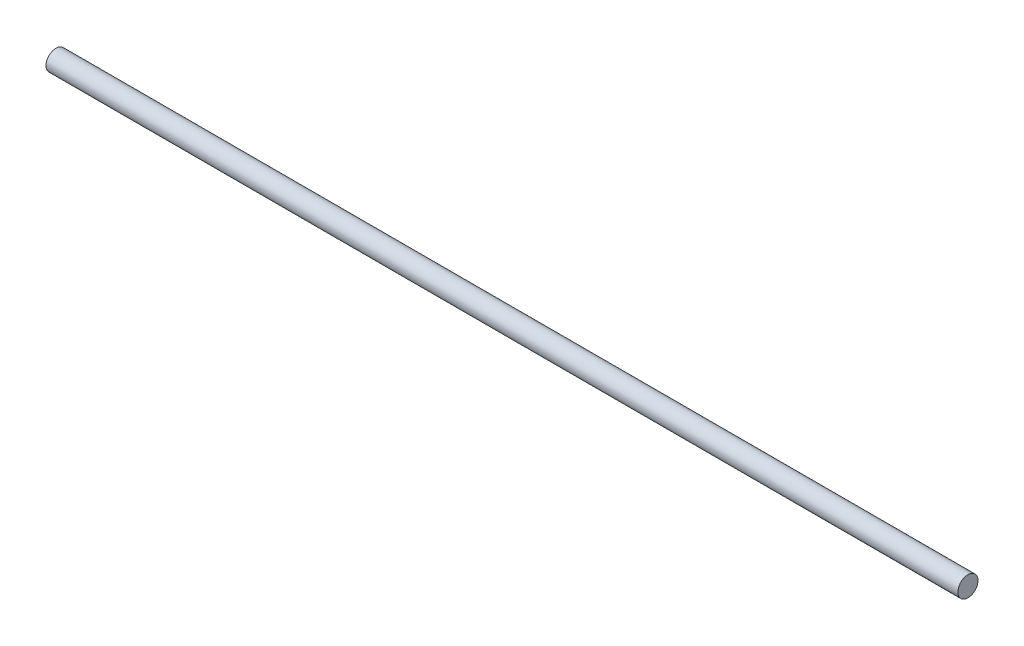
ISO-10303-21;
HEADER;
FILE_DESCRIPTION(('STEP AP214'),'2;1');
FILE_NAME('part.step','',(''),(''),'','','');
FILE_SCHEMA(('AUTOMOTIVE_DESIGN { 1 0 10303 214 1 1 1 1 }'));
ENDSEC;
DATA;
#1=APPLICATION_CONTEXT('core data for automotive mechanical design processes');
#2=APPLICATION_PROTOCOL_DEFINITION('international standard','automotive_design',2000,#1);
#3=PRODUCT_CONTEXT('',#1,'mechanical');
#4=PRODUCT('Part','Part','',(#3));
#5=PRODUCT_RELATED_PRODUCT_CATEGORY('part','',(#4));
#6=PRODUCT_DEFINITION_FORMATION('','',#4);
#7=PRODUCT_DEFINITION_CONTEXT('part definition',#1,'design');
#8=PRODUCT_DEFINITION('design','',#6,#7);
#9=PRODUCT_DEFINITION_SHAPE('','',#8);
#10=(LENGTH_UNIT() NAMED_UNIT(*) SI_UNIT(.MILLI.,.METRE.));
#11=(NAMED_UNIT(*) PLANE_ANGLE_UNIT() SI_UNIT($,.RADIAN.));
#12=(NAMED_UNIT(*) SI_UNIT($,.STERADIAN.) SOLID_ANGLE_UNIT());
#13=UNCERTAINTY_MEASURE_WITH_UNIT(LENGTH_MEASURE(1.E-05),#10,'distance_accuracy_value','');
#14=(GEOMETRIC_REPRESENTATION_CONTEXT(3) GLOBAL_UNCERTAINTY_ASSIGNED_CONTEXT((#13)) GLOBAL_UNIT_ASSIGNED_CONTEXT((#10,
#11,#12)) REPRESENTATION_CONTEXT('',''));
#15=CARTESIAN_POINT('',(0.,0.,0.));
#16=DIRECTION('',(0.,0.,1.));
#17=DIRECTION('',(1.,0.,0.));
#18=AXIS2_PLACEMENT_3D('',#15,#16,#17);
#19=CARTESIAN_POINT('',(680.,0.,0.));
#20=DIRECTION('',(-1.,0.,0.));
#21=DIRECTION('',(0.,0.,1.));
#22=AXIS2_PLACEMENT_3D('',#19,#20,#21);
#23=CYLINDRICAL_SURFACE('',#22,7.5);
#24=CARTESIAN_POINT('',(680.,0.,0.));
#25=DIRECTION('',(1.,0.,0.));
#26=DIRECTION('',(0.,0.,-1.));
#27=AXIS2_PLACEMENT_3D('',#24,#25,#26);
#28=CIRCLE('',#27,7.5);
#29=CARTESIAN_POINT('',(680.,0.,-7.5));
#30=VERTEX_POINT('',#29);
#31=EDGE_CURVE('E10',#30,#30,#28,.T.);
#32=ORIENTED_EDGE('',*,*,#31,.F.);
#33=EDGE_LOOP('',(#32));
#34=FACE_BOUND('',#33,.T.);
#35=CARTESIAN_POINT('',(0.,0.,0.));
#36=DIRECTION('',(1.,0.,0.));
#37=DIRECTION('',(0.,0.,-1.));
#38=AXIS2_PLACEMENT_3D('',#35,#36,#37);
#39=CIRCLE('',#38,7.5);
#40=CARTESIAN_POINT('',(0.,0.,-7.5));
#41=VERTEX_POINT('',#40);
#42=EDGE_CURVE('E33',#41,#41,#39,.T.);
#43=ORIENTED_EDGE('',*,*,#42,.T.);
#44=EDGE_LOOP('',(#43));
#45=FACE_BOUND('',#44,.T.);
#46=ADVANCED_FACE('F30',(#34,#45),#23,.T.);
#47=CARTESIAN_POINT('',(680.,0.,0.));
#48=DIRECTION('',(1.,0.,0.));
#49=DIRECTION('',(0.,0.,-1.));
#50=AXIS2_PLACEMENT_3D('',#47,#48,#49);
#51=PLANE('',#50);
#52=ORIENTED_EDGE('',*,*,#31,.T.);
#53=EDGE_LOOP('',(#52));
#54=FACE_BOUND('',#53,.T.);
#55=ADVANCED_FACE('F45',(#54),#51,.T.);
#56=CARTESIAN_POINT('',(0.,0.,0.));
#57=DIRECTION('',(1.,0.,0.));
#58=DIRECTION('',(0.,0.,-1.));
#59=AXIS2_PLACEMENT_3D('',#56,#57,#58);
#60=PLANE('',#59);
#61=ORIENTED_EDGE('',*,*,#42,.F.);
#62=EDGE_LOOP('',(#61));
#63=FACE_BOUND('',#62,.T.);
#64=ADVANCED_FACE('F43',(#63),#60,.F.);
#65=CLOSED_SHELL('',(#46,#55,#64));
#66=MANIFOLD_SOLID_BREP('B2',#65);
#67=ADVANCED_BREP_SHAPE_REPRESENTATION('',(#18,#66),#14);
#68=SHAPE_DEFINITION_REPRESENTATION(#9,#67);
ENDSEC;
END-ISO-10303-21;
